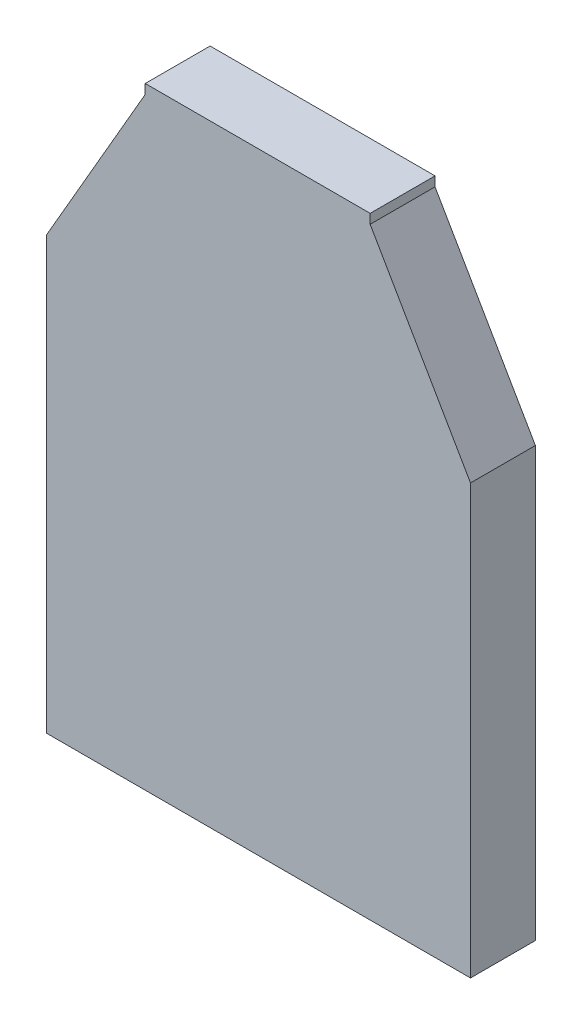
ISO-10303-21;
HEADER;
FILE_DESCRIPTION(('STEP AP214'),'2;1');
FILE_NAME('part.step','',(''),(''),'','','');
FILE_SCHEMA(('AUTOMOTIVE_DESIGN { 1 0 10303 214 1 1 1 1 }'));
ENDSEC;
DATA;
#1=APPLICATION_CONTEXT('core data for automotive mechanical design processes');
#2=APPLICATION_PROTOCOL_DEFINITION('international standard','automotive_design',2000,#1);
#3=PRODUCT_CONTEXT('',#1,'mechanical');
#4=PRODUCT('Part','Part','',(#3));
#5=PRODUCT_RELATED_PRODUCT_CATEGORY('part','',(#4));
#6=PRODUCT_DEFINITION_FORMATION('','',#4);
#7=PRODUCT_DEFINITION_CONTEXT('part definition',#1,'design');
#8=PRODUCT_DEFINITION('design','',#6,#7);
#9=PRODUCT_DEFINITION_SHAPE('','',#8);
#10=(LENGTH_UNIT() NAMED_UNIT(*) SI_UNIT(.MILLI.,.METRE.));
#11=(NAMED_UNIT(*) PLANE_ANGLE_UNIT() SI_UNIT($,.RADIAN.));
#12=(NAMED_UNIT(*) SI_UNIT($,.STERADIAN.) SOLID_ANGLE_UNIT());
#13=UNCERTAINTY_MEASURE_WITH_UNIT(LENGTH_MEASURE(1.E-05),#10,'distance_accuracy_value','');
#14=(GEOMETRIC_REPRESENTATION_CONTEXT(3) GLOBAL_UNCERTAINTY_ASSIGNED_CONTEXT((#13)) GLOBAL_UNIT_ASSIGNED_CONTEXT((#10,
#11,#12)) REPRESENTATION_CONTEXT('',''));
#15=CARTESIAN_POINT('',(0.,0.,0.));
#16=DIRECTION('',(0.,0.,1.));
#17=DIRECTION('',(1.,0.,0.));
#18=AXIS2_PLACEMENT_3D('',#15,#16,#17);
#19=CARTESIAN_POINT('',(-130.,2165.5,-200.));
#20=DIRECTION('',(1.,0.,0.));
#21=DIRECTION('',(0.,-1.,0.));
#22=AXIS2_PLACEMENT_3D('',#19,#20,#21);
#23=PLANE('',#22);
#24=DIRECTION('',(0.,1.,0.));
#25=VECTOR('',#24,1.);
#26=CARTESIAN_POINT('',(-130.,2165.5,-125.));
#27=LINE('',#26,#25);
#28=CARTESIAN_POINT('',(-130.,2165.5,-125.));
#29=VERTEX_POINT('',#28);
#30=CARTESIAN_POINT('',(-130.,2176.5,-125.));
#31=VERTEX_POINT('',#30);
#32=EDGE_CURVE('E85',#29,#31,#27,.T.);
#33=ORIENTED_EDGE('',*,*,#32,.T.);
#34=DIRECTION('',(0.,0.,1.));
#35=VECTOR('',#34,1.);
#36=CARTESIAN_POINT('',(-130.,2176.5,-200.));
#37=LINE('',#36,#35);
#38=CARTESIAN_POINT('',(-130.,2176.5,-200.));
#39=VERTEX_POINT('',#38);
#40=EDGE_CURVE('E11',#39,#31,#37,.T.);
#41=ORIENTED_EDGE('',*,*,#40,.F.);
#42=DIRECTION('',(0.,1.,0.));
#43=VECTOR('',#42,1.);
#44=CARTESIAN_POINT('',(-130.,2165.5,-200.));
#45=LINE('',#44,#43);
#46=CARTESIAN_POINT('',(-130.,2165.5,-200.));
#47=VERTEX_POINT('',#46);
#48=EDGE_CURVE('E106',#47,#39,#45,.T.);
#49=ORIENTED_EDGE('',*,*,#48,.F.);
#50=DIRECTION('',(0.,0.,1.));
#51=VECTOR('',#50,1.);
#52=CARTESIAN_POINT('',(-130.,2165.5,-200.));
#53=LINE('',#52,#51);
#54=EDGE_CURVE('E98',#47,#29,#53,.T.);
#55=ORIENTED_EDGE('',*,*,#54,.T.);
#56=EDGE_LOOP('',(#33,#41,#49,#55));
#57=FACE_BOUND('',#56,.T.);
#58=ADVANCED_FACE('F17',(#57),#23,.F.);
#59=CARTESIAN_POINT('',(-130.,2176.5,-200.));
#60=DIRECTION('',(0.,-1.,0.));
#61=DIRECTION('',(-1.,0.,0.));
#62=AXIS2_PLACEMENT_3D('',#59,#60,#61);
#63=PLANE('',#62);
#64=DIRECTION('',(1.,0.,0.));
#65=VECTOR('',#64,1.);
#66=CARTESIAN_POINT('',(-130.,2176.5,-125.));
#67=LINE('',#66,#65);
#68=CARTESIAN_POINT('',(130.,2176.5,-125.));
#69=VERTEX_POINT('',#68);
#70=EDGE_CURVE('E81',#31,#69,#67,.T.);
#71=ORIENTED_EDGE('',*,*,#70,.T.);
#72=DIRECTION('',(0.,0.,1.));
#73=VECTOR('',#72,1.);
#74=CARTESIAN_POINT('',(130.,2176.5,-200.));
#75=LINE('',#74,#73);
#76=CARTESIAN_POINT('',(130.,2176.5,-200.));
#77=VERTEX_POINT('',#76);
#78=EDGE_CURVE('E24',#77,#69,#75,.T.);
#79=ORIENTED_EDGE('',*,*,#78,.F.);
#80=DIRECTION('',(1.,0.,0.));
#81=VECTOR('',#80,1.);
#82=CARTESIAN_POINT('',(-130.,2176.5,-200.));
#83=LINE('',#82,#81);
#84=EDGE_CURVE('E94',#39,#77,#83,.T.);
#85=ORIENTED_EDGE('',*,*,#84,.F.);
#86=ORIENTED_EDGE('',*,*,#40,.T.);
#87=EDGE_LOOP('',(#71,#79,#85,#86));
#88=FACE_BOUND('',#87,.T.);
#89=ADVANCED_FACE('F93',(#88),#63,.F.);
#90=CARTESIAN_POINT('',(130.,2176.5,-200.));
#91=DIRECTION('',(-1.,0.,0.));
#92=DIRECTION('',(0.,1.,0.));
#93=AXIS2_PLACEMENT_3D('',#90,#91,#92);
#94=PLANE('',#93);
#95=DIRECTION('',(0.,-1.,0.));
#96=VECTOR('',#95,1.);
#97=CARTESIAN_POINT('',(130.,2176.5,-125.));
#98=LINE('',#97,#96);
#99=CARTESIAN_POINT('',(130.,2165.5,-125.));
#100=VERTEX_POINT('',#99);
#101=EDGE_CURVE('E87',#69,#100,#98,.T.);
#102=ORIENTED_EDGE('',*,*,#101,.T.);
#103=DIRECTION('',(0.,0.,1.));
#104=VECTOR('',#103,1.);
#105=CARTESIAN_POINT('',(130.,2165.5,-200.));
#106=LINE('',#105,#104);
#107=CARTESIAN_POINT('',(130.,2165.5,-200.));
#108=VERTEX_POINT('',#107);
#109=EDGE_CURVE('E130',#108,#100,#106,.T.);
#110=ORIENTED_EDGE('',*,*,#109,.F.);
#111=DIRECTION('',(0.,-1.,0.));
#112=VECTOR('',#111,1.);
#113=CARTESIAN_POINT('',(130.,2176.5,-200.));
#114=LINE('',#113,#112);
#115=EDGE_CURVE('E105',#77,#108,#114,.T.);
#116=ORIENTED_EDGE('',*,*,#115,.F.);
#117=ORIENTED_EDGE('',*,*,#78,.T.);
#118=EDGE_LOOP('',(#102,#110,#116,#117));
#119=FACE_BOUND('',#118,.T.);
#120=ADVANCED_FACE('F134',(#119),#94,.F.);
#121=CARTESIAN_POINT('',(130.,2165.5,-200.));
#122=DIRECTION('',(-0.866025403784439,-0.5,0.));
#123=DIRECTION('',(-0.5,0.866025403784439,0.));
#124=AXIS2_PLACEMENT_3D('',#121,#122,#123);
#125=PLANE('',#124);
#126=DIRECTION('',(0.5,-0.866025403784439,0.));
#127=VECTOR('',#126,1.);
#128=CARTESIAN_POINT('',(130.,2165.5,-125.));
#129=LINE('',#128,#127);
#130=CARTESIAN_POINT('',(246.,1964.58210632201,-125.));
#131=VERTEX_POINT('',#130);
#132=EDGE_CURVE('E143',#100,#131,#129,.T.);
#133=ORIENTED_EDGE('',*,*,#132,.T.);
#134=DIRECTION('',(0.,0.,1.));
#135=VECTOR('',#134,1.);
#136=CARTESIAN_POINT('',(246.,1964.58210632201,-200.));
#137=LINE('',#136,#135);
#138=CARTESIAN_POINT('',(246.,1964.58210632201,-200.));
#139=VERTEX_POINT('',#138);
#140=EDGE_CURVE('E127',#139,#131,#137,.T.);
#141=ORIENTED_EDGE('',*,*,#140,.F.);
#142=DIRECTION('',(0.5,-0.866025403784439,0.));
#143=VECTOR('',#142,1.);
#144=CARTESIAN_POINT('',(130.,2165.5,-200.));
#145=LINE('',#144,#143);
#146=EDGE_CURVE('E108',#108,#139,#145,.T.);
#147=ORIENTED_EDGE('',*,*,#146,.F.);
#148=ORIENTED_EDGE('',*,*,#109,.T.);
#149=EDGE_LOOP('',(#133,#141,#147,#148));
#150=FACE_BOUND('',#149,.T.);
#151=ADVANCED_FACE('F142',(#150),#125,.F.);
#152=CARTESIAN_POINT('',(246.,1964.58210632201,-200.));
#153=DIRECTION('',(-1.,0.,0.));
#154=DIRECTION('',(0.,1.,0.));
#155=AXIS2_PLACEMENT_3D('',#152,#153,#154);
#156=PLANE('',#155);
#157=DIRECTION('',(0.,-1.,0.));
#158=VECTOR('',#157,1.);
#159=CARTESIAN_POINT('',(246.,1964.58210632201,-125.));
#160=LINE('',#159,#158);
#161=CARTESIAN_POINT('',(246.,1469.,-125.));
#162=VERTEX_POINT('',#161);
#163=EDGE_CURVE('E148',#131,#162,#160,.T.);
#164=ORIENTED_EDGE('',*,*,#163,.T.);
#165=DIRECTION('',(0.,0.,1.));
#166=VECTOR('',#165,1.);
#167=CARTESIAN_POINT('',(246.,1469.,-200.));
#168=LINE('',#167,#166);
#169=CARTESIAN_POINT('',(246.,1469.,-200.));
#170=VERTEX_POINT('',#169);
#171=EDGE_CURVE('E124',#170,#162,#168,.T.);
#172=ORIENTED_EDGE('',*,*,#171,.F.);
#173=DIRECTION('',(0.,-1.,0.));
#174=VECTOR('',#173,1.);
#175=CARTESIAN_POINT('',(246.,1964.58210632201,-200.));
#176=LINE('',#175,#174);
#177=EDGE_CURVE('E110',#139,#170,#176,.T.);
#178=ORIENTED_EDGE('',*,*,#177,.F.);
#179=ORIENTED_EDGE('',*,*,#140,.T.);
#180=EDGE_LOOP('',(#164,#172,#178,#179));
#181=FACE_BOUND('',#180,.T.);
#182=ADVANCED_FACE('F146',(#181),#156,.F.);
#183=CARTESIAN_POINT('',(246.,1469.,-200.));
#184=DIRECTION('',(0.,1.,0.));
#185=DIRECTION('',(1.,0.,0.));
#186=AXIS2_PLACEMENT_3D('',#183,#184,#185);
#187=PLANE('',#186);
#188=DIRECTION('',(-1.,0.,0.));
#189=VECTOR('',#188,1.);
#190=CARTESIAN_POINT('',(246.,1469.,-125.));
#191=LINE('',#190,#189);
#192=CARTESIAN_POINT('',(-244.,1469.,-125.));
#193=VERTEX_POINT('',#192);
#194=EDGE_CURVE('E153',#162,#193,#191,.T.);
#195=ORIENTED_EDGE('',*,*,#194,.T.);
#196=DIRECTION('',(0.,0.,1.));
#197=VECTOR('',#196,1.);
#198=CARTESIAN_POINT('',(-244.,1469.,-200.));
#199=LINE('',#198,#197);
#200=CARTESIAN_POINT('',(-244.,1469.,-200.));
#201=VERTEX_POINT('',#200);
#202=EDGE_CURVE('E121',#201,#193,#199,.T.);
#203=ORIENTED_EDGE('',*,*,#202,.F.);
#204=DIRECTION('',(-1.,0.,0.));
#205=VECTOR('',#204,1.);
#206=CARTESIAN_POINT('',(246.,1469.,-200.));
#207=LINE('',#206,#205);
#208=EDGE_CURVE('E112',#170,#201,#207,.T.);
#209=ORIENTED_EDGE('',*,*,#208,.F.);
#210=ORIENTED_EDGE('',*,*,#171,.T.);
#211=EDGE_LOOP('',(#195,#203,#209,#210));
#212=FACE_BOUND('',#211,.T.);
#213=ADVANCED_FACE('F152',(#212),#187,.F.);
#214=CARTESIAN_POINT('',(-244.,1469.,-200.));
#215=DIRECTION('',(1.,0.,0.));
#216=DIRECTION('',(0.,-1.,0.));
#217=AXIS2_PLACEMENT_3D('',#214,#215,#216);
#218=PLANE('',#217);
#219=DIRECTION('',(0.,1.,0.));
#220=VECTOR('',#219,1.);
#221=CARTESIAN_POINT('',(-244.,1469.,-125.));
#222=LINE('',#221,#220);
#223=CARTESIAN_POINT('',(-244.,1968.04620793715,-125.));
#224=VERTEX_POINT('',#223);
#225=EDGE_CURVE('E157',#193,#224,#222,.T.);
#226=ORIENTED_EDGE('',*,*,#225,.T.);
#227=DIRECTION('',(0.,0.,1.));
#228=VECTOR('',#227,1.);
#229=CARTESIAN_POINT('',(-244.,1968.04620793715,-200.));
#230=LINE('',#229,#228);
#231=CARTESIAN_POINT('',(-244.,1968.04620793715,-200.));
#232=VERTEX_POINT('',#231);
#233=EDGE_CURVE('E118',#232,#224,#230,.T.);
#234=ORIENTED_EDGE('',*,*,#233,.F.);
#235=DIRECTION('',(0.,1.,0.));
#236=VECTOR('',#235,1.);
#237=CARTESIAN_POINT('',(-244.,1469.,-200.));
#238=LINE('',#237,#236);
#239=EDGE_CURVE('E36',#201,#232,#238,.T.);
#240=ORIENTED_EDGE('',*,*,#239,.F.);
#241=ORIENTED_EDGE('',*,*,#202,.T.);
#242=EDGE_LOOP('',(#226,#234,#240,#241));
#243=FACE_BOUND('',#242,.T.);
#244=ADVANCED_FACE('F156',(#243),#218,.F.);
#245=CARTESIAN_POINT('',(-244.,1968.04620793715,-200.));
#246=DIRECTION('',(0.866025403784438,-0.5,0.));
#247=DIRECTION('',(-0.5,-0.866025403784439,0.));
#248=AXIS2_PLACEMENT_3D('',#245,#246,#247);
#249=PLANE('',#248);
#250=DIRECTION('',(0.5,0.866025403784439,0.));
#251=VECTOR('',#250,1.);
#252=CARTESIAN_POINT('',(-244.,1968.04620793715,-125.));
#253=LINE('',#252,#251);
#254=EDGE_CURVE('E102',#224,#29,#253,.T.);
#255=ORIENTED_EDGE('',*,*,#254,.T.);
#256=ORIENTED_EDGE('',*,*,#54,.F.);
#257=DIRECTION('',(0.5,0.866025403784439,0.));
#258=VECTOR('',#257,1.);
#259=CARTESIAN_POINT('',(-244.,1968.04620793715,-200.));
#260=LINE('',#259,#258);
#261=EDGE_CURVE('E31',#232,#47,#260,.T.);
#262=ORIENTED_EDGE('',*,*,#261,.F.);
#263=ORIENTED_EDGE('',*,*,#233,.T.);
#264=EDGE_LOOP('',(#255,#256,#262,#263));
#265=FACE_BOUND('',#264,.T.);
#266=ADVANCED_FACE('F159',(#265),#249,.F.);
#267=CARTESIAN_POINT('',(-130.,2176.5,-200.));
#268=DIRECTION('',(0.,0.,-1.));
#269=DIRECTION('',(0.,1.,0.));
#270=AXIS2_PLACEMENT_3D('',#267,#268,#269);
#271=PLANE('',#270);
#272=ORIENTED_EDGE('',*,*,#48,.T.);
#273=ORIENTED_EDGE('',*,*,#84,.T.);
#274=ORIENTED_EDGE('',*,*,#115,.T.);
#275=ORIENTED_EDGE('',*,*,#146,.T.);
#276=ORIENTED_EDGE('',*,*,#177,.T.);
#277=ORIENTED_EDGE('',*,*,#208,.T.);
#278=ORIENTED_EDGE('',*,*,#239,.T.);
#279=ORIENTED_EDGE('',*,*,#261,.T.);
#280=EDGE_LOOP('',(#272,#273,#274,#275,#276,#277,#278,#279));
#281=FACE_BOUND('',#280,.T.);
#282=ADVANCED_FACE('F137',(#281),#271,.T.);
#283=CARTESIAN_POINT('',(-130.,2176.5,-125.));
#284=DIRECTION('',(0.,0.,-1.));
#285=DIRECTION('',(0.,1.,0.));
#286=AXIS2_PLACEMENT_3D('',#283,#284,#285);
#287=PLANE('',#286);
#288=ORIENTED_EDGE('',*,*,#32,.F.);
#289=ORIENTED_EDGE('',*,*,#254,.F.);
#290=ORIENTED_EDGE('',*,*,#225,.F.);
#291=ORIENTED_EDGE('',*,*,#194,.F.);
#292=ORIENTED_EDGE('',*,*,#163,.F.);
#293=ORIENTED_EDGE('',*,*,#132,.F.);
#294=ORIENTED_EDGE('',*,*,#101,.F.);
#295=ORIENTED_EDGE('',*,*,#70,.F.);
#296=EDGE_LOOP('',(#288,#289,#290,#291,#292,#293,#294,#295));
#297=FACE_BOUND('',#296,.T.);
#298=ADVANCED_FACE('F82',(#297),#287,.F.);
#299=CLOSED_SHELL('',(#58,#89,#120,#151,#182,#213,#244,#266,#282,#298));
#300=MANIFOLD_SOLID_BREP('B1',#299);
#301=ADVANCED_BREP_SHAPE_REPRESENTATION('',(#18,#300),#14);
#302=SHAPE_DEFINITION_REPRESENTATION(#9,#301);
ENDSEC;
END-ISO-10303-21;
